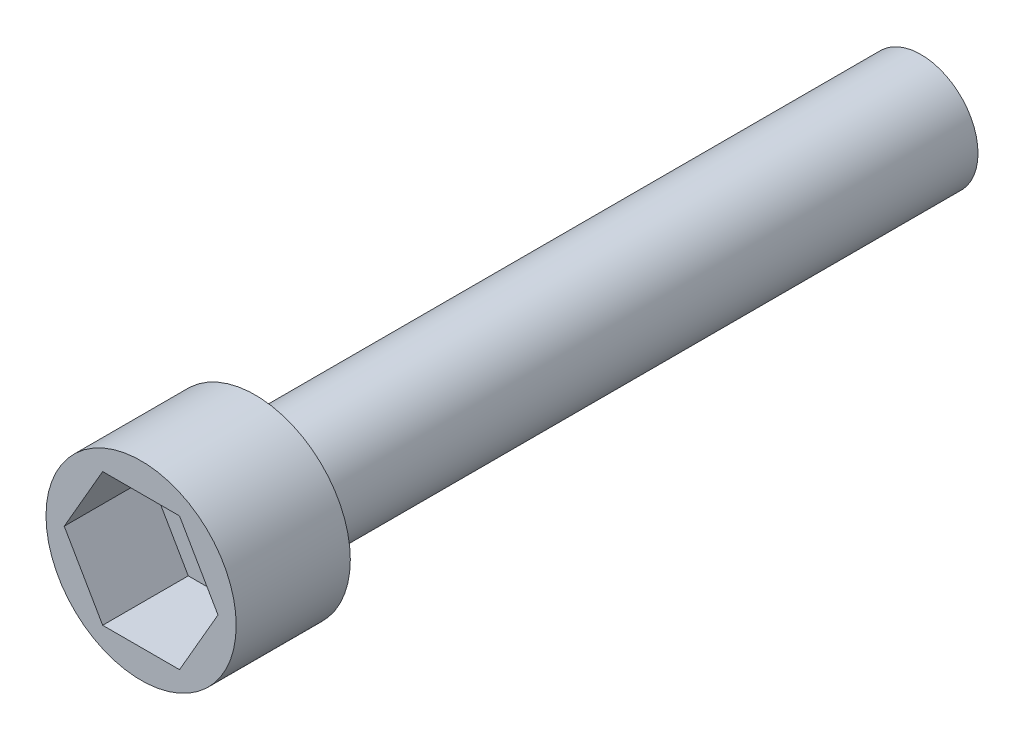
ISO-10303-21;
HEADER;
FILE_DESCRIPTION(('STEP AP214'),'2;1');
FILE_NAME('part.step','',(''),(''),'','','');
FILE_SCHEMA(('AUTOMOTIVE_DESIGN { 1 0 10303 214 1 1 1 1 }'));
ENDSEC;
DATA;
#1=APPLICATION_CONTEXT('core data for automotive mechanical design processes');
#2=APPLICATION_PROTOCOL_DEFINITION('international standard','automotive_design',2000,#1);
#3=PRODUCT_CONTEXT('',#1,'mechanical');
#4=PRODUCT('Part','Part','',(#3));
#5=PRODUCT_RELATED_PRODUCT_CATEGORY('part','',(#4));
#6=PRODUCT_DEFINITION_FORMATION('','',#4);
#7=PRODUCT_DEFINITION_CONTEXT('part definition',#1,'design');
#8=PRODUCT_DEFINITION('design','',#6,#7);
#9=PRODUCT_DEFINITION_SHAPE('','',#8);
#10=(LENGTH_UNIT() NAMED_UNIT(*) SI_UNIT(.MILLI.,.METRE.));
#11=(NAMED_UNIT(*) PLANE_ANGLE_UNIT() SI_UNIT($,.RADIAN.));
#12=(NAMED_UNIT(*) SI_UNIT($,.STERADIAN.) SOLID_ANGLE_UNIT());
#13=UNCERTAINTY_MEASURE_WITH_UNIT(LENGTH_MEASURE(1.E-05),#10,'distance_accuracy_value','');
#14=(GEOMETRIC_REPRESENTATION_CONTEXT(3) GLOBAL_UNCERTAINTY_ASSIGNED_CONTEXT((#13)) GLOBAL_UNIT_ASSIGNED_CONTEXT((#10,
#11,#12)) REPRESENTATION_CONTEXT('',''));
#15=CARTESIAN_POINT('',(0.,0.,0.));
#16=DIRECTION('',(0.,0.,1.));
#17=DIRECTION('',(1.,0.,0.));
#18=AXIS2_PLACEMENT_3D('',#15,#16,#17);
#19=CARTESIAN_POINT('',(0.,0.,35.));
#20=DIRECTION('',(0.,0.,-1.));
#21=DIRECTION('',(-1.,0.,0.));
#22=AXIS2_PLACEMENT_3D('',#19,#20,#21);
#23=CYLINDRICAL_SURFACE('',#22,3.);
#24=CARTESIAN_POINT('',(0.,0.,35.));
#25=DIRECTION('',(0.,0.,1.));
#26=DIRECTION('',(1.,0.,0.));
#27=AXIS2_PLACEMENT_3D('',#24,#25,#26);
#28=CIRCLE('',#27,3.);
#29=CARTESIAN_POINT('',(3.,0.,35.));
#30=VERTEX_POINT('',#29);
#31=EDGE_CURVE('E11',#30,#30,#28,.T.);
#32=ORIENTED_EDGE('',*,*,#31,.F.);
#33=EDGE_LOOP('',(#32));
#34=FACE_BOUND('',#33,.T.);
#35=CARTESIAN_POINT('',(0.,0.,0.));
#36=DIRECTION('',(0.,0.,1.));
#37=DIRECTION('',(1.,0.,0.));
#38=AXIS2_PLACEMENT_3D('',#35,#36,#37);
#39=CIRCLE('',#38,3.);
#40=CARTESIAN_POINT('',(3.,0.,0.));
#41=VERTEX_POINT('',#40);
#42=EDGE_CURVE('E44',#41,#41,#39,.T.);
#43=ORIENTED_EDGE('',*,*,#42,.T.);
#44=EDGE_LOOP('',(#43));
#45=FACE_BOUND('',#44,.T.);
#46=ADVANCED_FACE('F41',(#34,#45),#23,.T.);
#47=CARTESIAN_POINT('',(0.,0.,0.));
#48=DIRECTION('',(0.,0.,1.));
#49=DIRECTION('',(1.,0.,0.));
#50=AXIS2_PLACEMENT_3D('',#47,#48,#49);
#51=PLANE('',#50);
#52=ORIENTED_EDGE('',*,*,#42,.F.);
#53=EDGE_LOOP('',(#52));
#54=FACE_BOUND('',#53,.T.);
#55=ADVANCED_FACE('F191',(#54),#51,.F.);
#56=CARTESIAN_POINT('',(0.,0.,41.));
#57=DIRECTION('',(0.,0.,-1.));
#58=DIRECTION('',(-1.,0.,0.));
#59=AXIS2_PLACEMENT_3D('',#56,#57,#58);
#60=CYLINDRICAL_SURFACE('',#59,5.);
#61=CARTESIAN_POINT('',(0.,0.,41.));
#62=DIRECTION('',(0.,0.,1.));
#63=DIRECTION('',(1.,0.,0.));
#64=AXIS2_PLACEMENT_3D('',#61,#62,#63);
#65=CIRCLE('',#64,5.);
#66=CARTESIAN_POINT('',(5.,0.,41.));
#67=VERTEX_POINT('',#66);
#68=EDGE_CURVE('E165',#67,#67,#65,.T.);
#69=ORIENTED_EDGE('',*,*,#68,.F.);
#70=EDGE_LOOP('',(#69));
#71=FACE_BOUND('',#70,.T.);
#72=CARTESIAN_POINT('',(0.,0.,35.));
#73=DIRECTION('',(0.,0.,1.));
#74=DIRECTION('',(1.,0.,0.));
#75=AXIS2_PLACEMENT_3D('',#72,#73,#74);
#76=CIRCLE('',#75,5.);
#77=CARTESIAN_POINT('',(5.,0.,35.));
#78=VERTEX_POINT('',#77);
#79=EDGE_CURVE('E155',#78,#78,#76,.T.);
#80=ORIENTED_EDGE('',*,*,#79,.T.);
#81=EDGE_LOOP('',(#80));
#82=FACE_BOUND('',#81,.T.);
#83=ADVANCED_FACE('F173',(#71,#82),#60,.T.);
#84=CARTESIAN_POINT('',(0.,0.,41.));
#85=DIRECTION('',(0.,0.,1.));
#86=DIRECTION('',(1.,0.,0.));
#87=AXIS2_PLACEMENT_3D('',#84,#85,#86);
#88=PLANE('',#87);
#89=DIRECTION('',(0.5,0.866025403784439,0.));
#90=VECTOR('',#89,1.);
#91=CARTESIAN_POINT('',(2.02072594216369,-3.5,41.));
#92=LINE('',#91,#90);
#93=CARTESIAN_POINT('',(2.02072594216369,-3.5,41.));
#94=VERTEX_POINT('',#93);
#95=CARTESIAN_POINT('',(4.04145188432738,0.,41.));
#96=VERTEX_POINT('',#95);
#97=EDGE_CURVE('E56',#94,#96,#92,.T.);
#98=ORIENTED_EDGE('',*,*,#97,.F.);
#99=DIRECTION('',(1.,0.,0.));
#100=VECTOR('',#99,1.);
#101=CARTESIAN_POINT('',(-2.02072594216369,-3.5,41.));
#102=LINE('',#101,#100);
#103=CARTESIAN_POINT('',(-2.02072594216369,-3.5,41.));
#104=VERTEX_POINT('',#103);
#105=EDGE_CURVE('E149',#104,#94,#102,.T.);
#106=ORIENTED_EDGE('',*,*,#105,.F.);
#107=DIRECTION('',(0.5,-0.866025403784439,0.));
#108=VECTOR('',#107,1.);
#109=CARTESIAN_POINT('',(-4.04145188432738,0.,41.));
#110=LINE('',#109,#108);
#111=CARTESIAN_POINT('',(-4.04145188432738,0.,41.));
#112=VERTEX_POINT('',#111);
#113=EDGE_CURVE('E146',#112,#104,#110,.T.);
#114=ORIENTED_EDGE('',*,*,#113,.F.);
#115=DIRECTION('',(-0.5,-0.866025403784439,0.));
#116=VECTOR('',#115,1.);
#117=CARTESIAN_POINT('',(-2.02072594216369,3.5,41.));
#118=LINE('',#117,#116);
#119=CARTESIAN_POINT('',(-2.02072594216369,3.5,41.));
#120=VERTEX_POINT('',#119);
#121=EDGE_CURVE('E104',#120,#112,#118,.T.);
#122=ORIENTED_EDGE('',*,*,#121,.F.);
#123=DIRECTION('',(-1.,0.,0.));
#124=VECTOR('',#123,1.);
#125=CARTESIAN_POINT('',(2.02072594216369,3.5,41.));
#126=LINE('',#125,#124);
#127=CARTESIAN_POINT('',(2.02072594216369,3.5,41.));
#128=VERTEX_POINT('',#127);
#129=EDGE_CURVE('E140',#128,#120,#126,.T.);
#130=ORIENTED_EDGE('',*,*,#129,.F.);
#131=DIRECTION('',(-0.5,0.866025403784439,0.));
#132=VECTOR('',#131,1.);
#133=CARTESIAN_POINT('',(4.04145188432738,0.,41.));
#134=LINE('',#133,#132);
#135=EDGE_CURVE('E136',#96,#128,#134,.T.);
#136=ORIENTED_EDGE('',*,*,#135,.F.);
#137=EDGE_LOOP('',(#98,#106,#114,#122,#130,#136));
#138=FACE_BOUND('',#137,.T.);
#139=ORIENTED_EDGE('',*,*,#68,.T.);
#140=EDGE_LOOP('',(#139));
#141=FACE_BOUND('',#140,.T.);
#142=ADVANCED_FACE('F178',(#138,#141),#88,.T.);
#143=CARTESIAN_POINT('',(0.,0.,35.));
#144=DIRECTION('',(0.,0.,1.));
#145=DIRECTION('',(1.,0.,0.));
#146=AXIS2_PLACEMENT_3D('',#143,#144,#145);
#147=PLANE('',#146);
#148=ORIENTED_EDGE('',*,*,#31,.T.);
#149=EDGE_LOOP('',(#148));
#150=FACE_BOUND('',#149,.T.);
#151=ORIENTED_EDGE('',*,*,#79,.F.);
#152=EDGE_LOOP('',(#151));
#153=FACE_BOUND('',#152,.T.);
#154=ADVANCED_FACE('F175',(#150,#153),#147,.F.);
#155=CARTESIAN_POINT('',(2.02072594216369,-3.5,36.5));
#156=DIRECTION('',(0.866025403784439,-0.5,0.));
#157=DIRECTION('',(0.5,0.866025403784439,0.));
#158=AXIS2_PLACEMENT_3D('',#155,#156,#157);
#159=PLANE('',#158);
#160=ORIENTED_EDGE('',*,*,#97,.T.);
#161=DIRECTION('',(0.,0.,1.));
#162=VECTOR('',#161,1.);
#163=CARTESIAN_POINT('',(4.04145188432738,0.,36.5));
#164=LINE('',#163,#162);
#165=CARTESIAN_POINT('',(4.04145188432738,0.,36.5));
#166=VERTEX_POINT('',#165);
#167=EDGE_CURVE('E86',#166,#96,#164,.T.);
#168=ORIENTED_EDGE('',*,*,#167,.F.);
#169=DIRECTION('',(0.5,0.866025403784439,0.));
#170=VECTOR('',#169,1.);
#171=CARTESIAN_POINT('',(2.02072594216369,-3.5,36.5));
#172=LINE('',#171,#170);
#173=CARTESIAN_POINT('',(2.02072594216369,-3.5,36.5));
#174=VERTEX_POINT('',#173);
#175=EDGE_CURVE('E152',#174,#166,#172,.T.);
#176=ORIENTED_EDGE('',*,*,#175,.F.);
#177=DIRECTION('',(0.,0.,1.));
#178=VECTOR('',#177,1.);
#179=CARTESIAN_POINT('',(2.02072594216369,-3.5,36.5));
#180=LINE('',#179,#178);
#181=EDGE_CURVE('E64',#174,#94,#180,.T.);
#182=ORIENTED_EDGE('',*,*,#181,.T.);
#183=EDGE_LOOP('',(#160,#168,#176,#182));
#184=FACE_BOUND('',#183,.T.);
#185=ADVANCED_FACE('F177',(#184),#159,.F.);
#186=CARTESIAN_POINT('',(-2.02072594216369,-3.5,36.5));
#187=DIRECTION('',(0.,-1.,0.));
#188=DIRECTION('',(1.,0.,0.));
#189=AXIS2_PLACEMENT_3D('',#186,#187,#188);
#190=PLANE('',#189);
#191=ORIENTED_EDGE('',*,*,#105,.T.);
#192=ORIENTED_EDGE('',*,*,#181,.F.);
#193=DIRECTION('',(1.,0.,0.));
#194=VECTOR('',#193,1.);
#195=CARTESIAN_POINT('',(-2.02072594216369,-3.5,36.5));
#196=LINE('',#195,#194);
#197=CARTESIAN_POINT('',(-2.02072594216369,-3.5,36.5));
#198=VERTEX_POINT('',#197);
#199=EDGE_CURVE('E118',#198,#174,#196,.T.);
#200=ORIENTED_EDGE('',*,*,#199,.F.);
#201=DIRECTION('',(0.,0.,1.));
#202=VECTOR('',#201,1.);
#203=CARTESIAN_POINT('',(-2.02072594216369,-3.5,36.5));
#204=LINE('',#203,#202);
#205=EDGE_CURVE('E109',#198,#104,#204,.T.);
#206=ORIENTED_EDGE('',*,*,#205,.T.);
#207=EDGE_LOOP('',(#191,#192,#200,#206));
#208=FACE_BOUND('',#207,.T.);
#209=ADVANCED_FACE('F185',(#208),#190,.F.);
#210=CARTESIAN_POINT('',(-4.04145188432738,0.,36.5));
#211=DIRECTION('',(-0.866025403784439,-0.5,0.));
#212=DIRECTION('',(0.5,-0.866025403784439,0.));
#213=AXIS2_PLACEMENT_3D('',#210,#211,#212);
#214=PLANE('',#213);
#215=ORIENTED_EDGE('',*,*,#113,.T.);
#216=ORIENTED_EDGE('',*,*,#205,.F.);
#217=DIRECTION('',(0.5,-0.866025403784439,0.));
#218=VECTOR('',#217,1.);
#219=CARTESIAN_POINT('',(-4.04145188432738,0.,36.5));
#220=LINE('',#219,#218);
#221=CARTESIAN_POINT('',(-4.04145188432738,0.,36.5));
#222=VERTEX_POINT('',#221);
#223=EDGE_CURVE('E113',#222,#198,#220,.T.);
#224=ORIENTED_EDGE('',*,*,#223,.F.);
#225=DIRECTION('',(0.,0.,1.));
#226=VECTOR('',#225,1.);
#227=CARTESIAN_POINT('',(-4.04145188432738,0.,36.5));
#228=LINE('',#227,#226);
#229=EDGE_CURVE('E97',#222,#112,#228,.T.);
#230=ORIENTED_EDGE('',*,*,#229,.T.);
#231=EDGE_LOOP('',(#215,#216,#224,#230));
#232=FACE_BOUND('',#231,.T.);
#233=ADVANCED_FACE('F114',(#232),#214,.F.);
#234=CARTESIAN_POINT('',(-2.02072594216369,3.5,36.5));
#235=DIRECTION('',(-0.866025403784439,0.5,0.));
#236=DIRECTION('',(-0.5,-0.866025403784439,0.));
#237=AXIS2_PLACEMENT_3D('',#234,#235,#236);
#238=PLANE('',#237);
#239=ORIENTED_EDGE('',*,*,#121,.T.);
#240=ORIENTED_EDGE('',*,*,#229,.F.);
#241=DIRECTION('',(-0.5,-0.866025403784439,0.));
#242=VECTOR('',#241,1.);
#243=CARTESIAN_POINT('',(-2.02072594216369,3.5,36.5));
#244=LINE('',#243,#242);
#245=CARTESIAN_POINT('',(-2.02072594216369,3.5,36.5));
#246=VERTEX_POINT('',#245);
#247=EDGE_CURVE('E101',#246,#222,#244,.T.);
#248=ORIENTED_EDGE('',*,*,#247,.F.);
#249=DIRECTION('',(0.,0.,1.));
#250=VECTOR('',#249,1.);
#251=CARTESIAN_POINT('',(-2.02072594216369,3.5,36.5));
#252=LINE('',#251,#250);
#253=EDGE_CURVE('E110',#246,#120,#252,.T.);
#254=ORIENTED_EDGE('',*,*,#253,.T.);
#255=EDGE_LOOP('',(#239,#240,#248,#254));
#256=FACE_BOUND('',#255,.T.);
#257=ADVANCED_FACE('F99',(#256),#238,.F.);
#258=CARTESIAN_POINT('',(2.02072594216369,3.5,36.5));
#259=DIRECTION('',(0.,1.,0.));
#260=DIRECTION('',(-1.,0.,0.));
#261=AXIS2_PLACEMENT_3D('',#258,#259,#260);
#262=PLANE('',#261);
#263=ORIENTED_EDGE('',*,*,#129,.T.);
#264=ORIENTED_EDGE('',*,*,#253,.F.);
#265=DIRECTION('',(-1.,0.,0.));
#266=VECTOR('',#265,1.);
#267=CARTESIAN_POINT('',(2.02072594216369,3.5,36.5));
#268=LINE('',#267,#266);
#269=CARTESIAN_POINT('',(2.02072594216369,3.5,36.5));
#270=VERTEX_POINT('',#269);
#271=EDGE_CURVE('E124',#270,#246,#268,.T.);
#272=ORIENTED_EDGE('',*,*,#271,.F.);
#273=DIRECTION('',(0.,0.,1.));
#274=VECTOR('',#273,1.);
#275=CARTESIAN_POINT('',(2.02072594216369,3.5,36.5));
#276=LINE('',#275,#274);
#277=EDGE_CURVE('E160',#270,#128,#276,.T.);
#278=ORIENTED_EDGE('',*,*,#277,.T.);
#279=EDGE_LOOP('',(#263,#264,#272,#278));
#280=FACE_BOUND('',#279,.T.);
#281=ADVANCED_FACE('F247',(#280),#262,.F.);
#282=CARTESIAN_POINT('',(4.04145188432738,0.,36.5));
#283=DIRECTION('',(0.866025403784439,0.5,0.));
#284=DIRECTION('',(-0.5,0.866025403784439,0.));
#285=AXIS2_PLACEMENT_3D('',#282,#283,#284);
#286=PLANE('',#285);
#287=ORIENTED_EDGE('',*,*,#135,.T.);
#288=ORIENTED_EDGE('',*,*,#277,.F.);
#289=DIRECTION('',(-0.5,0.866025403784439,0.));
#290=VECTOR('',#289,1.);
#291=CARTESIAN_POINT('',(4.04145188432738,0.,36.5));
#292=LINE('',#291,#290);
#293=EDGE_CURVE('E128',#166,#270,#292,.T.);
#294=ORIENTED_EDGE('',*,*,#293,.F.);
#295=ORIENTED_EDGE('',*,*,#167,.T.);
#296=EDGE_LOOP('',(#287,#288,#294,#295));
#297=FACE_BOUND('',#296,.T.);
#298=ADVANCED_FACE('F256',(#297),#286,.F.);
#299=CARTESIAN_POINT('',(0.,0.,36.5));
#300=DIRECTION('',(0.,0.,1.));
#301=DIRECTION('',(1.,0.,0.));
#302=AXIS2_PLACEMENT_3D('',#299,#300,#301);
#303=PLANE('',#302);
#304=ORIENTED_EDGE('',*,*,#175,.T.);
#305=ORIENTED_EDGE('',*,*,#293,.T.);
#306=ORIENTED_EDGE('',*,*,#271,.T.);
#307=ORIENTED_EDGE('',*,*,#247,.T.);
#308=ORIENTED_EDGE('',*,*,#223,.T.);
#309=ORIENTED_EDGE('',*,*,#199,.T.);
#310=EDGE_LOOP('',(#304,#305,#306,#307,#308,#309));
#311=FACE_BOUND('',#310,.T.);
#312=ADVANCED_FACE('F121',(#311),#303,.T.);
#313=CLOSED_SHELL('',(#46,#55,#83,#142,#154,#185,#209,#233,#257,#281,#298,#312));
#314=MANIFOLD_SOLID_BREP('B2',#313);
#315=ADVANCED_BREP_SHAPE_REPRESENTATION('',(#18,#314),#14);
#316=SHAPE_DEFINITION_REPRESENTATION(#9,#315);
ENDSEC;
END-ISO-10303-21;
